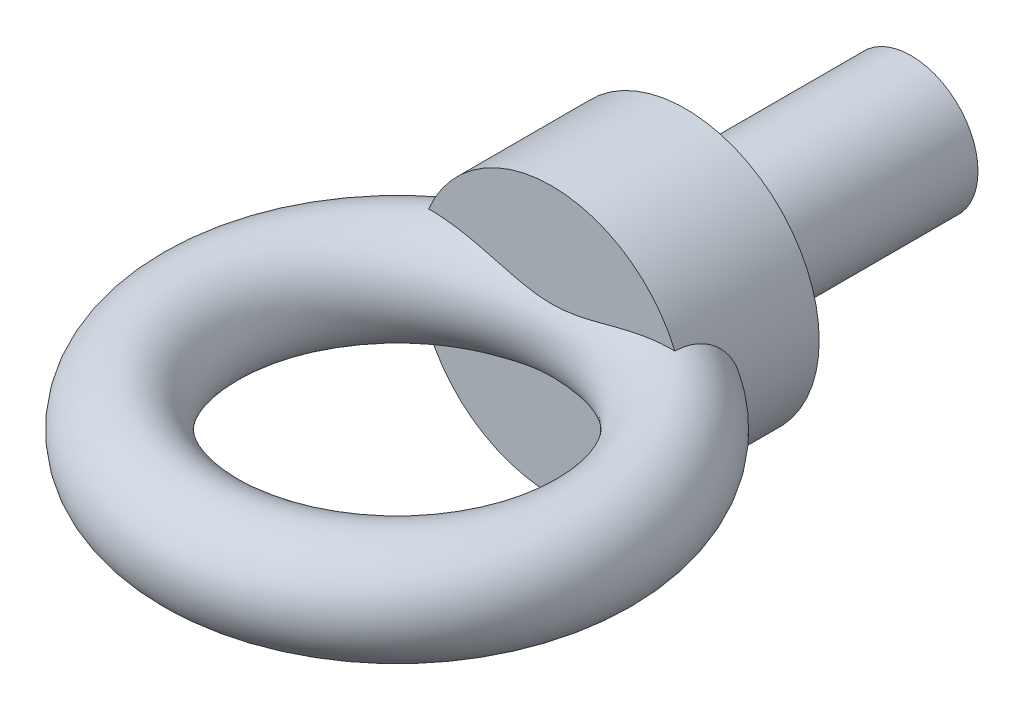
ISO-10303-21;
HEADER;
FILE_DESCRIPTION(('STEP AP214'),'2;1');
FILE_NAME('part.step','',(''),(''),'','','');
FILE_SCHEMA(('AUTOMOTIVE_DESIGN { 1 0 10303 214 1 1 1 1 }'));
ENDSEC;
DATA;
#1=APPLICATION_CONTEXT('core data for automotive mechanical design processes');
#2=APPLICATION_PROTOCOL_DEFINITION('international standard','automotive_design',2000,#1);
#3=PRODUCT_CONTEXT('',#1,'mechanical');
#4=PRODUCT('Part','Part','',(#3));
#5=PRODUCT_RELATED_PRODUCT_CATEGORY('part','',(#4));
#6=PRODUCT_DEFINITION_FORMATION('','',#4);
#7=PRODUCT_DEFINITION_CONTEXT('part definition',#1,'design');
#8=PRODUCT_DEFINITION('design','',#6,#7);
#9=PRODUCT_DEFINITION_SHAPE('','',#8);
#10=(LENGTH_UNIT() NAMED_UNIT(*) SI_UNIT(.MILLI.,.METRE.));
#11=(NAMED_UNIT(*) PLANE_ANGLE_UNIT() SI_UNIT($,.RADIAN.));
#12=(NAMED_UNIT(*) SI_UNIT($,.STERADIAN.) SOLID_ANGLE_UNIT());
#13=UNCERTAINTY_MEASURE_WITH_UNIT(LENGTH_MEASURE(1.E-05),#10,'distance_accuracy_value','');
#14=(GEOMETRIC_REPRESENTATION_CONTEXT(3) GLOBAL_UNCERTAINTY_ASSIGNED_CONTEXT((#13)) GLOBAL_UNIT_ASSIGNED_CONTEXT((#10,
#11,#12)) REPRESENTATION_CONTEXT('',''));
#15=CARTESIAN_POINT('',(0.,0.,0.));
#16=DIRECTION('',(0.,0.,1.));
#17=DIRECTION('',(1.,0.,0.));
#18=AXIS2_PLACEMENT_3D('',#15,#16,#17);
#19=CARTESIAN_POINT('',(0.,0.,38.));
#20=DIRECTION('',(0.,0.,-1.));
#21=DIRECTION('',(-1.,0.,0.));
#22=AXIS2_PLACEMENT_3D('',#19,#20,#21);
#23=CYLINDRICAL_SURFACE('',#22,8.);
#24=CARTESIAN_POINT('',(0.,0.,27.));
#25=DIRECTION('',(0.,0.,-1.));
#26=DIRECTION('',(-1.,0.,0.));
#27=AXIS2_PLACEMENT_3D('',#24,#25,#26);
#28=CIRCLE('',#27,8.);
#29=CARTESIAN_POINT('',(-8.,0.,27.));
#30=VERTEX_POINT('',#29);
#31=EDGE_CURVE('E40',#30,#30,#28,.T.);
#32=ORIENTED_EDGE('',*,*,#31,.T.);
#33=EDGE_LOOP('',(#32));
#34=FACE_BOUND('',#33,.T.);
#35=CARTESIAN_POINT('',(0.,0.,0.));
#36=DIRECTION('',(0.,0.,1.));
#37=DIRECTION('',(1.,0.,0.));
#38=AXIS2_PLACEMENT_3D('',#35,#36,#37);
#39=CIRCLE('',#38,8.);
#40=CARTESIAN_POINT('',(8.,0.,0.));
#41=VERTEX_POINT('',#40);
#42=EDGE_CURVE('E70',#41,#41,#39,.T.);
#43=ORIENTED_EDGE('',*,*,#42,.T.);
#44=EDGE_LOOP('',(#43));
#45=FACE_BOUND('',#44,.T.);
#46=ADVANCED_FACE('F37',(#34,#45),#23,.T.);
#47=CARTESIAN_POINT('',(0.,0.,0.));
#48=DIRECTION('',(0.,0.,1.));
#49=DIRECTION('',(1.,0.,0.));
#50=AXIS2_PLACEMENT_3D('',#47,#48,#49);
#51=PLANE('',#50);
#52=ORIENTED_EDGE('',*,*,#42,.F.);
#53=EDGE_LOOP('',(#52));
#54=FACE_BOUND('',#53,.T.);
#55=ADVANCED_FACE('F95',(#54),#51,.F.);
#56=CARTESIAN_POINT('',(0.,0.,27.));
#57=DIRECTION('',(0.,0.,-1.));
#58=DIRECTION('',(-1.,0.,0.));
#59=AXIS2_PLACEMENT_3D('',#56,#57,#58);
#60=PLANE('',#59);
#61=CARTESIAN_POINT('',(0.,0.,27.));
#62=DIRECTION('',(0.,0.,-1.));
#63=DIRECTION('',(-1.,0.,0.));
#64=AXIS2_PLACEMENT_3D('',#61,#62,#63);
#65=CIRCLE('',#64,16.);
#66=CARTESIAN_POINT('',(-16.,0.,27.));
#67=VERTEX_POINT('',#66);
#68=EDGE_CURVE('E104',#67,#67,#65,.T.);
#69=ORIENTED_EDGE('',*,*,#68,.T.);
#70=EDGE_LOOP('',(#69));
#71=FACE_BOUND('',#70,.T.);
#72=ORIENTED_EDGE('',*,*,#31,.F.);
#73=EDGE_LOOP('',(#72));
#74=FACE_BOUND('',#73,.T.);
#75=ADVANCED_FACE('F91',(#71,#74),#60,.T.);
#76=CARTESIAN_POINT('',(0.,0.,43.));
#77=DIRECTION('',(0.,0.,-1.));
#78=DIRECTION('',(-1.,0.,0.));
#79=AXIS2_PLACEMENT_3D('',#76,#77,#78);
#80=PLANE('',#79);
#81=CARTESIAN_POINT('',(0.,3.75,43.));
#82=CARTESIAN_POINT('',(-0.198423396746859,3.74999995550212,43.));
#83=CARTESIAN_POINT('',(-0.396846671015667,3.75427233843891,43.));
#84=CARTESIAN_POINT('',(-0.793333269074827,3.77118099676362,43.));
#85=CARTESIAN_POINT('',(-0.991396589913736,3.78381734042451,43.));
#86=CARTESIAN_POINT('',(-1.3869247684004,3.81694718796056,43.));
#87=CARTESIAN_POINT('',(-1.58438940026312,3.83744335550718,43.));
#88=CARTESIAN_POINT('',(-1.97846242137758,3.88552072140098,43.));
#89=CARTESIAN_POINT('',(-2.17507072089126,3.91310264494743,43.));
#90=CARTESIAN_POINT('',(-2.7658891808467,4.00546937939409,43.));
#91=CARTESIAN_POINT('',(-3.15862776940045,4.07964733416842,43.));
#92=CARTESIAN_POINT('',(-3.94043001600997,4.24467462046787,43.));
#93=CARTESIAN_POINT('',(-4.32949361657075,4.33552421236711,43.));
#94=CARTESIAN_POINT('',(-5.11418581352902,4.52844031136013,43.));
#95=CARTESIAN_POINT('',(-5.50976213914991,4.63071514791662,43.));
#96=CARTESIAN_POINT('',(-6.30019287796965,4.83789823443915,43.));
#97=CARTESIAN_POINT('',(-6.69504731358739,4.94280640108159,43.));
#98=CARTESIAN_POINT('',(-7.48440322741912,5.14927849238733,43.));
#99=CARTESIAN_POINT('',(-7.87890231799305,5.25085135944986,43.));
#100=CARTESIAN_POINT('',(-8.66983609693245,5.44611975373133,43.));
#101=CARTESIAN_POINT('',(-9.06627060816277,5.53981598805375,43.));
#102=CARTESIAN_POINT('',(-9.90912522672644,5.72534373448948,43.));
#103=CARTESIAN_POINT('',(-10.3558920053108,5.81563321804062,43.));
#104=CARTESIAN_POINT('',(-11.2536667751676,5.97506002743001,43.));
#105=CARTESIAN_POINT('',(-11.7046780237068,6.04417946138532,43.));
#106=CARTESIAN_POINT('',(-12.6070125776594,6.1548724126057,43.));
#107=CARTESIAN_POINT('',(-13.0583122290433,6.19663282058239,43.));
#108=CARTESIAN_POINT('',(-13.9626499104719,6.24731404678441,43.));
#109=CARTESIAN_POINT('',(-14.415686672986,6.25625544112103,43.));
#110=CARTESIAN_POINT('',(-15.1756247315836,6.23833154015333,43.));
#111=CARTESIAN_POINT('',(-15.4827582390791,6.22203801264576,43.));
#112=CARTESIAN_POINT('',(-16.095223713451,6.16926798742631,43.));
#113=CARTESIAN_POINT('',(-16.4005554913617,6.13278940943293,43.));
#114=CARTESIAN_POINT('',(-17.3117031147484,5.98959223925518,43.));
#115=CARTESIAN_POINT('',(-17.9132046904611,5.84910763830606,43.));
#116=CARTESIAN_POINT('',(-18.7080986991128,5.58461304841486,43.));
#117=CARTESIAN_POINT('',(-18.9175015433598,5.50706057973655,43.));
#118=CARTESIAN_POINT('',(-19.3302013865198,5.33697203707702,43.));
#119=CARTESIAN_POINT('',(-19.5334988779317,5.2444371755459,43.));
#120=CARTESIAN_POINT('',(-19.9319902865479,5.04380926426041,43.));
#121=CARTESIAN_POINT('',(-20.1271933815675,4.93573449241167,43.));
#122=CARTESIAN_POINT('',(-20.5077293554823,4.70340025648093,43.));
#123=CARTESIAN_POINT('',(-20.6930646216145,4.57914473216071,43.));
#124=CARTESIAN_POINT('',(-21.0135686322292,4.34222435078197,43.));
#125=CARTESIAN_POINT('',(-21.1510480079273,4.23267952394133,43.));
#126=CARTESIAN_POINT('',(-21.417165774657,4.00334748863613,43.));
#127=CARTESIAN_POINT('',(-21.5458061566497,3.88356260045183,43.));
#128=CARTESIAN_POINT('',(-21.792943907475,3.6338441612182,43.));
#129=CARTESIAN_POINT('',(-21.9114379225744,3.50390728150931,43.));
#130=CARTESIAN_POINT('',(-22.1367350141629,3.23433693483305,43.));
#131=CARTESIAN_POINT('',(-22.2435434393351,3.09470795233645,43.));
#132=CARTESIAN_POINT('',(-22.4450326247993,2.80487355984491,43.));
#133=CARTESIAN_POINT('',(-22.5395831440075,2.65457728799674,43.));
#134=CARTESIAN_POINT('',(-22.7137366549663,2.3456411220357,43.));
#135=CARTESIAN_POINT('',(-22.7933477995545,2.18700583962294,43.));
#136=CARTESIAN_POINT('',(-22.9362209961176,1.86262371130598,43.));
#137=CARTESIAN_POINT('',(-22.9994923801865,1.69688098801714,43.));
#138=CARTESIAN_POINT('',(-23.1084960040307,1.35973009663464,43.));
#139=CARTESIAN_POINT('',(-23.1542317940507,1.18832308297057,43.));
#140=CARTESIAN_POINT('',(-23.2216665713312,0.868015134277959,43.));
#141=CARTESIAN_POINT('',(-23.2459635307068,0.719656556359104,43.));
#142=CARTESIAN_POINT('',(-23.2808955091594,0.421344428898531,43.));
#143=CARTESIAN_POINT('',(-23.2915320794188,0.271391062400446,43.));
#144=CARTESIAN_POINT('',(-23.2989712394451,-0.0287938549404037,43.));
#145=CARTESIAN_POINT('',(-23.2957795798328,-0.179025264180264,43.));
#146=CARTESIAN_POINT('',(-23.2756271470357,-0.478559371286684,43.));
#147=CARTESIAN_POINT('',(-23.2586667497531,-0.627862094395302,43.));
#148=CARTESIAN_POINT('',(-23.2131375035494,-0.912514021152957,43.));
#149=CARTESIAN_POINT('',(-23.1855980339577,-1.04802936837302,43.));
#150=CARTESIAN_POINT('',(-23.1194384312782,-1.31637009914684,43.));
#151=CARTESIAN_POINT('',(-23.0808148243673,-1.44919462539055,43.));
#152=CARTESIAN_POINT('',(-22.9929940111684,-1.71123600525403,43.));
#153=CARTESIAN_POINT('',(-22.9438008927572,-1.84045423188068,43.));
#154=CARTESIAN_POINT('',(-22.8354006679346,-2.09466413876428,43.));
#155=CARTESIAN_POINT('',(-22.7761898607177,-2.21965423648478,43.));
#156=CARTESIAN_POINT('',(-22.6456765773356,-2.47001409173636,43.));
#157=CARTESIAN_POINT('',(-22.5739646186059,-2.59517051328209,43.));
#158=CARTESIAN_POINT('',(-22.4211674763651,-2.83964403226768,43.));
#159=CARTESIAN_POINT('',(-22.3400785661125,-2.95895878101335,43.));
#160=CARTESIAN_POINT('',(-22.0839433996449,-3.30746007841177,43.));
#161=CARTESIAN_POINT('',(-21.8959642683196,-3.52732532977695,43.));
#162=CARTESIAN_POINT('',(-21.5533226117657,-3.87742438428632,43.));
#163=CARTESIAN_POINT('',(-21.4056759409805,-4.01471025223961,43.));
#164=CARTESIAN_POINT('',(-21.0988520364842,-4.27586003170931,43.));
#165=CARTESIAN_POINT('',(-20.9396712985938,-4.39971983546844,43.));
#166=CARTESIAN_POINT('',(-20.6114661762948,-4.63416116072778,43.));
#167=CARTESIAN_POINT('',(-20.4424258470511,-4.74472023574139,43.));
#168=CARTESIAN_POINT('',(-20.0963853050063,-4.95262462218103,43.));
#169=CARTESIAN_POINT('',(-19.9193829787294,-5.04996639724962,43.));
#170=CARTESIAN_POINT('',(-19.4925633434036,-5.26529943747948,43.));
#171=CARTESIAN_POINT('',(-19.2399207154444,-5.3777070968034,43.));
#172=CARTESIAN_POINT('',(-18.7257235289241,-5.57987763461362,43.));
#173=CARTESIAN_POINT('',(-18.4641654084163,-5.66963133905002,43.));
#174=CARTESIAN_POINT('',(-17.9348912860215,-5.82797617908452,43.));
#175=CARTESIAN_POINT('',(-17.6671780248965,-5.89657654498519,43.));
#176=CARTESIAN_POINT('',(-17.1276096357227,-6.01427738082363,43.));
#177=CARTESIAN_POINT('',(-16.8557551429958,-6.06338081119012,43.));
#178=CARTESIAN_POINT('',(-16.1519663564316,-6.16690757222461,43.));
#179=CARTESIAN_POINT('',(-15.7180645077628,-6.2080892297402,43.));
#180=CARTESIAN_POINT('',(-14.8480893402886,-6.25231851171307,43.));
#181=CARTESIAN_POINT('',(-14.4120141106986,-6.25532263547538,43.));
#182=CARTESIAN_POINT('',(-13.5376398424001,-6.22886156791381,43.));
#183=CARTESIAN_POINT('',(-13.0993491548057,-6.19914896185863,43.));
#184=CARTESIAN_POINT('',(-12.2263273708261,-6.11255245873142,43.));
#185=CARTESIAN_POINT('',(-11.7915915416811,-6.05571415854742,43.));
#186=CARTESIAN_POINT('',(-10.777715465773,-5.89702958545962,43.));
#187=CARTESIAN_POINT('',(-10.1999657838886,-5.78644150555436,43.));
#188=CARTESIAN_POINT('',(-9.3377898745057,-5.6005087548055,43.));
#189=CARTESIAN_POINT('',(-9.05108794268787,-5.53517578276686,43.));
#190=CARTESIAN_POINT('',(-8.47888051733222,-5.39944988519891,43.));
#191=CARTESIAN_POINT('',(-8.19337501014559,-5.32905701756013,43.));
#192=CARTESIAN_POINT('',(-7.62197550842847,-5.18461531821318,43.));
#193=CARTESIAN_POINT('',(-7.33608526398849,-5.11055186070995,43.));
#194=CARTESIAN_POINT('',(-6.7646923620775,-4.9609443426892,43.));
#195=CARTESIAN_POINT('',(-6.47918970785066,-4.88540026985947,43.));
#196=CARTESIAN_POINT('',(-5.90781334748087,-4.73488792483878,43.));
#197=CARTESIAN_POINT('',(-5.62193952195269,-4.65992010223917,43.));
#198=CARTESIAN_POINT('',(-5.04940103557008,-4.5130194016709,43.));
#199=CARTESIAN_POINT('',(-4.7627363686684,-4.44108654697835,43.));
#200=CARTESIAN_POINT('',(-4.19066425418257,-4.30365421838109,43.));
#201=CARTESIAN_POINT('',(-3.90526985679876,-4.23810119970996,43.));
#202=CARTESIAN_POINT('',(-3.33258453320332,-4.11570506173031,43.));
#203=CARTESIAN_POINT('',(-3.04529359499694,-4.05886199756342,43.));
#204=CARTESIAN_POINT('',(-2.46908343251301,-3.9572281519219,43.));
#205=CARTESIAN_POINT('',(-2.18016813722613,-3.91241556209669,43.));
#206=CARTESIAN_POINT('',(-1.60038042434401,-3.83783450120299,43.));
#207=CARTESIAN_POINT('',(-1.30950819317648,-3.80806461709069,43.));
#208=CARTESIAN_POINT('',(-0.728682668033709,-3.76616545586183,43.));
#209=CARTESIAN_POINT('',(-0.438739182381732,-3.7539038715317,43.));
#210=CARTESIAN_POINT('',(0.141344715081138,-3.74768969643752,43.));
#211=CARTESIAN_POINT('',(0.431485123261104,-3.75373677679419,43.));
#212=CARTESIAN_POINT('',(1.01115999125035,-3.78360946531476,43.));
#213=CARTESIAN_POINT('',(1.30069335856246,-3.80745567710119,43.));
#214=CARTESIAN_POINT('',(1.87800743748997,-3.87093784803906,43.));
#215=CARTESIAN_POINT('',(2.16578796955785,-3.91057539801428,43.));
#216=CARTESIAN_POINT('',(2.73982142262915,-4.0028298912073,43.));
#217=CARTESIAN_POINT('',(3.02606998341025,-4.05547336652715,43.));
#218=CARTESIAN_POINT('',(3.59656698102858,-4.17049652512421,43.));
#219=CARTESIAN_POINT('',(3.88081541862102,-4.23287620472497,43.));
#220=CARTESIAN_POINT('',(4.44779792748375,-4.36431384910602,43.));
#221=CARTESIAN_POINT('',(4.7305316960506,-4.43337309982754,43.));
#222=CARTESIAN_POINT('',(5.29500618268296,-4.57539935942628,43.));
#223=CARTESIAN_POINT('',(5.57674689147766,-4.64836640468272,43.));
#224=CARTESIAN_POINT('',(6.14317227202853,-4.79666060750985,43.));
#225=CARTESIAN_POINT('',(6.42785225591383,-4.87200548807052,43.));
#226=CARTESIAN_POINT('',(6.99736751701189,-5.02201447785041,43.));
#227=CARTESIAN_POINT('',(7.28220277948276,-5.09667864269591,43.));
#228=CARTESIAN_POINT('',(7.85246596680532,-5.24335739472754,43.));
#229=CARTESIAN_POINT('',(8.13789367237814,-5.31537282367618,43.));
#230=CARTESIAN_POINT('',(8.70982009250352,-5.45500397723036,43.));
#231=CARTESIAN_POINT('',(8.99631879687006,-5.52261974356809,43.));
#232=CARTESIAN_POINT('',(9.85597295310252,-5.7159313995529,43.));
#233=CARTESIAN_POINT('',(10.4312254170602,-5.83261452574154,43.));
#234=CARTESIAN_POINT('',(11.5879748236467,-6.02927905682577,43.));
#235=CARTESIAN_POINT('',(12.169467941493,-6.10928175956268,43.));
#236=CARTESIAN_POINT('',(13.0432003500798,-6.19210514035793,43.));
#237=CARTESIAN_POINT('',(13.3336760950507,-6.21350544835059,43.));
#238=CARTESIAN_POINT('',(13.9153030314038,-6.24251959204934,43.));
#239=CARTESIAN_POINT('',(14.2064542774692,-6.25013226964452,43.));
#240=CARTESIAN_POINT('',(15.0791338519432,-6.24973087523678,43.));
#241=CARTESIAN_POINT('',(15.6611010166147,-6.21860597498551,43.));
#242=CARTESIAN_POINT('',(16.5192339901242,-6.1158115438755,43.));
#243=CARTESIAN_POINT('',(16.7990304340724,-6.07315483610391,43.));
#244=CARTESIAN_POINT('',(17.3551032634806,-5.96804057022212,43.));
#245=CARTESIAN_POINT('',(17.631377836164,-5.90557321182636,43.));
#246=CARTESIAN_POINT('',(18.179323034365,-5.75877796661344,43.));
#247=CARTESIAN_POINT('',(18.4509707757578,-5.67436348691614,43.));
#248=CARTESIAN_POINT('',(18.9857130095649,-5.48216753862108,43.));
#249=CARTESIAN_POINT('',(19.2488113140967,-5.37439665351615,43.));
#250=CARTESIAN_POINT('',(19.8695404461021,-5.08417402601651,43.));
#251=CARTESIAN_POINT('',(20.2215758597036,-4.88923383995729,43.));
#252=CARTESIAN_POINT('',(20.7227631868834,-4.55755470348433,43.));
#253=CARTESIAN_POINT('',(20.8852126693848,-4.44057414223244,43.));
#254=CARTESIAN_POINT('',(21.1996767491117,-4.19328885369036,43.));
#255=CARTESIAN_POINT('',(21.3516940352491,-4.06298758155205,43.));
#256=CARTESIAN_POINT('',(21.6172959146,-3.8136133203118,43.));
#257=CARTESIAN_POINT('',(21.7328986195681,-3.6966844550917,43.));
#258=CARTESIAN_POINT('',(21.9545732127698,-3.45412814972378,43.));
#259=CARTESIAN_POINT('',(22.0606471137674,-3.32850255655486,43.));
#260=CARTESIAN_POINT('',(22.2621415682476,-3.0688309318631,43.));
#261=CARTESIAN_POINT('',(22.3575552687011,-2.93477956927015,43.));
#262=CARTESIAN_POINT('',(22.5363896744976,-2.65896592166994,43.));
#263=CARTESIAN_POINT('',(22.6198157206666,-2.5172071095863,43.));
#264=CARTESIAN_POINT('',(22.7741345256525,-2.22558110918198,43.));
#265=CARTESIAN_POINT('',(22.844924149091,-2.07565917230263,43.));
#266=CARTESIAN_POINT('',(22.9719980039413,-1.76985849165559,43.));
#267=CARTESIAN_POINT('',(23.0282894373947,-1.61398274982994,43.));
#268=CARTESIAN_POINT('',(23.1254157571944,-1.29755195188226,43.));
#269=CARTESIAN_POINT('',(23.166257539145,-1.13699901786325,43.));
#270=CARTESIAN_POINT('',(23.231760846586,-0.812631060634574,43.));
#271=CARTESIAN_POINT('',(23.256424672459,-0.648816504617394,43.));
#272=CARTESIAN_POINT('',(23.2870274102391,-0.340520302060521,43.));
#273=CARTESIAN_POINT('',(23.2949504464328,-0.196232467211082,43.));
#274=CARTESIAN_POINT('',(23.2980092472342,0.0924756891008986,43.));
#275=CARTESIAN_POINT('',(23.2931458501982,0.236896001256779,43.));
#276=CARTESIAN_POINT('',(23.2707073736324,0.524706330197441,43.));
#277=CARTESIAN_POINT('',(23.2531353547421,0.668096586656662,43.));
#278=CARTESIAN_POINT('',(23.2055426253827,0.952793567715443,43.));
#279=CARTESIAN_POINT('',(23.1755218695112,1.09410028471407,43.));
#280=CARTESIAN_POINT('',(23.1049673084847,1.36777077982335,43.));
#281=CARTESIAN_POINT('',(23.0649244812013,1.50026167836337,43.));
#282=CARTESIAN_POINT('',(22.9742930191328,1.76162598732406,43.));
#283=CARTESIAN_POINT('',(22.9237009853988,1.89049821658903,43.));
#284=CARTESIAN_POINT('',(22.8125890810736,2.14383896580503,43.));
#285=CARTESIAN_POINT('',(22.7520723039278,2.26830884327693,43.));
#286=CARTESIAN_POINT('',(22.6217664083335,2.51231600559827,43.));
#287=CARTESIAN_POINT('',(22.5519738754772,2.6318514527448,43.));
#288=CARTESIAN_POINT('',(22.3190024833443,2.99917690534585,43.));
#289=CARTESIAN_POINT('',(22.1403029505801,3.23730831600603,43.));
#290=CARTESIAN_POINT('',(21.7506390791843,3.68532490801034,43.));
#291=CARTESIAN_POINT('',(21.5396557661491,3.89519334085332,43.));
#292=CARTESIAN_POINT('',(21.1538237805208,4.23187356328378,43.));
#293=CARTESIAN_POINT('',(20.9849744522076,4.36566241774674,43.));
#294=CARTESIAN_POINT('',(20.6361523870158,4.61791752302886,43.));
#295=CARTESIAN_POINT('',(20.4561758301895,4.73637846816793,43.));
#296=CARTESIAN_POINT('',(19.902229561466,5.0694351872953,43.));
#297=CARTESIAN_POINT('',(19.514571360657,5.2614266366353,43.));
#298=CARTESIAN_POINT('',(18.5552545354118,5.65572605729238,43.));
#299=CARTESIAN_POINT('',(17.9725412377852,5.83085520838686,43.));
#300=CARTESIAN_POINT('',(17.0846480872716,6.02318412183355,43.));
#301=CARTESIAN_POINT('',(16.786207327266,6.07557596773712,43.));
#302=CARTESIAN_POINT('',(16.1863393200067,6.15913450186268,43.));
#303=CARTESIAN_POINT('',(15.8849123756549,6.1903033209119,43.));
#304=CARTESIAN_POINT('',(15.0769289037944,6.2480594463329,43.));
#305=CARTESIAN_POINT('',(14.5691390837394,6.25737803128975,43.));
#306=CARTESIAN_POINT('',(13.554536828501,6.23165520108445,43.));
#307=CARTESIAN_POINT('',(13.0477258482302,6.19657009309426,43.));
#308=CARTESIAN_POINT('',(12.0336925535253,6.09019336512061,43.));
#309=CARTESIAN_POINT('',(11.5265039750508,6.01859386693228,43.));
#310=CARTESIAN_POINT('',(10.5175287027518,5.84751564272656,43.));
#311=CARTESIAN_POINT('',(10.0157371433259,5.74806468185829,43.));
#312=CARTESIAN_POINT('',(9.11579353120014,5.55124847255307,43.));
#313=CARTESIAN_POINT('',(8.71685295561798,5.45739257505687,43.));
#314=CARTESIAN_POINT('',(7.92096633704098,5.26153538333205,43.));
#315=CARTESIAN_POINT('',(7.52402046432249,5.15953340586513,43.));
#316=CARTESIAN_POINT('',(6.72979634541329,4.95199387356586,43.));
#317=CARTESIAN_POINT('',(6.33252069474091,4.84644660137152,43.));
#318=CARTESIAN_POINT('',(5.53727953709038,4.63785832222211,43.));
#319=CARTESIAN_POINT('',(5.13931400721893,4.53481740021321,43.));
#320=CARTESIAN_POINT('',(4.35036736710686,4.34047222489773,43.));
#321=CARTESIAN_POINT('',(3.95944118460166,4.2489494859741,43.));
#322=CARTESIAN_POINT('',(3.17389148317248,4.08261964910723,43.));
#323=CARTESIAN_POINT('',(2.77926801978331,4.00781230050934,43.));
#324=CARTESIAN_POINT('',(2.18560499761417,3.91462991212061,43.));
#325=CARTESIAN_POINT('',(1.98805322840746,3.88679852281443,43.));
#326=CARTESIAN_POINT('',(1.59208268089847,3.83827893843412,43.));
#327=CARTESIAN_POINT('',(1.39366399447197,3.81759000414785,43.));
#328=CARTESIAN_POINT('',(0.996220052061525,3.78414532050323,43.));
#329=CARTESIAN_POINT('',(0.797195028952794,3.77138683674449,43.));
#330=CARTESIAN_POINT('',(0.398779960271054,3.75431424027366,43.));
#331=CARTESIAN_POINT('',(0.199389918298457,3.75000004471462,43.));
#332=CARTESIAN_POINT('',(0.,3.75,43.));
#333=B_SPLINE_CURVE_WITH_KNOTS('',3,(#81,#82,#83,#84,#85,#86,#87,#88,#89,#90,#91,#92,#93,#94,
#95,#96,#97,#98,#99,#100,#101,#102,#103,#104,#105,#106,#107,#108,#109,#110,#111,#112,#113,#114,
#115,#116,#117,#118,#119,#120,#121,#122,#123,#124,#125,#126,#127,#128,#129,#130,#131,#132,#133,
#134,#135,#136,#137,#138,#139,#140,#141,#142,#143,#144,#145,#146,#147,#148,#149,#150,#151,#152,
#153,#154,#155,#156,#157,#158,#159,#160,#161,#162,#163,#164,#165,#166,#167,#168,#169,#170,#171,
#172,#173,#174,#175,#176,#177,#178,#179,#180,#181,#182,#183,#184,#185,#186,#187,#188,#189,#190,
#191,#192,#193,#194,#195,#196,#197,#198,#199,#200,#201,#202,#203,#204,#205,#206,#207,#208,#209,
#210,#211,#212,#213,#214,#215,#216,#217,#218,#219,#220,#221,#222,#223,#224,#225,#226,#227,#228,
#229,#230,#231,#232,#233,#234,#235,#236,#237,#238,#239,#240,#241,#242,#243,#244,#245,#246,#247,
#248,#249,#250,#251,#252,#253,#254,#255,#256,#257,#258,#259,#260,#261,#262,#263,#264,#265,#266,
#267,#268,#269,#270,#271,#272,#273,#274,#275,#276,#277,#278,#279,#280,#281,#282,#283,#284,#285,
#286,#287,#288,#289,#290,#291,#292,#293,#294,#295,#296,#297,#298,#299,#300,#301,#302,#303,#304,
#305,#306,#307,#308,#309,#310,#311,#312,#313,#314,#315,#316,#317,#318,#319,#320,#321,#322,#323,
#324,#325,#326,#327,#328,#329,#330,#331,#332),.UNSPECIFIED.,.T.,.F.,(4,2,2,2,2,2,2,2,2,2,2,2,2,
2,2,2,2,2,2,2,2,2,2,2,2,2,2,2,2,2,2,2,2,2,2,2,2,2,2,2,2,2,2,2,2,2,2,2,2,2,2,2,2,2,2,2,2,2,2,2,2,
2,2,2,2,2,2,2,2,2,2,2,2,2,2,2,2,2,2,2,2,2,2,2,2,2,2,2,2,2,2,2,2,2,2,2,2,2,2,2,2,2,2,2,2,2,2,2,2,
2,2,2,2,2,2,2,2,2,2,2,2,2,2,2,2,4),(0.,0.595225231865657,1.19045532246982,1.78588731334739,
2.38138026864347,3.5797778540591,4.77819415738989,6.00390235359534,7.22957181481862,
8.45163011591722,9.67357859261079,11.0405994752606,12.4087725287151,13.7674992885905,
15.1253740395237,16.0474093546301,16.9695397128657,18.8122118738487,19.4816967585881,
20.1511274923195,20.8197771923015,21.488264389822,22.0151509318118,22.5419184022095,
23.0688593211368,23.5955580326582,24.1274602949314,24.6590714335733,25.1903782793925,
25.7215775003074,26.1719789620527,26.6223292747029,27.0724923222241,27.5226430801946,
27.9370284575751,28.3515438474613,28.7658992065472,29.1804079753136,29.6126827481439,
30.0451299170074,30.9096153160083,31.5137493139397,32.1180676304243,32.7233919064641,
33.3288778223698,34.157184997063,34.9858270705926,35.8141070511111,36.6422612168627,
37.9476679889165,39.2545620497363,40.5714075739792,41.8860473040736,43.6496778970184,
44.531812009634,45.413936031314,46.2999130545059,47.1858974482562,48.0725143799586,
48.9591381101642,49.8375274091328,50.7159222688446,51.5927138905175,52.4694231350283,
53.3394715260005,54.2095042883518,55.0805457336749,55.9516749501522,56.8245961614332,
57.6975170430944,58.5706063139722,59.4437037141995,60.3271499133378,61.210523260599,
62.0936134044067,62.9766951706071,64.736837800691,66.4959571366787,67.3694357708164,
68.2429877705876,69.9864468439798,70.8349746126211,71.6839228026066,72.5362727566744,
73.3882372897649,74.5903973991135,75.1903890423848,75.7902254516304,76.2830475019708,
76.7757652077872,77.2687978619576,77.7616101710389,78.258277104581,78.7546968386294,
79.2508947447452,79.747022079986,80.1799873350726,80.6129242030308,81.0457568407566,
81.4785910571036,81.8933634209827,82.3082696313773,82.7230467644906,83.1379770022317,
84.027420157528,84.917388094647,85.562829303575,86.2084933344944,87.5010951742215,
89.3160029309095,90.2244838326932,91.1328735080267,92.6539375185634,94.1764994065292,
95.7121167150839,97.2462085815915,98.4755874687902,99.7050695765157,100.938252182246,
102.171476525399,103.37579547431,104.580096362713,105.17849517844,105.776832043985,
106.374962489804,106.973087067332),.UNSPECIFIED.);
#334=CARTESIAN_POINT('',(-14.7295451407545,-6.24823974783893,43.));
#335=VERTEX_POINT('',#334);
#336=CARTESIAN_POINT('',(14.7295451407506,-6.24823974784829,43.));
#337=VERTEX_POINT('',#336);
#338=EDGE_CURVE('E11',#335,#337,#333,.T.);
#339=ORIENTED_EDGE('',*,*,#338,.F.);
#340=CARTESIAN_POINT('',(0.,0.,43.));
#341=DIRECTION('',(0.,0.,-1.));
#342=DIRECTION('',(-1.,0.,0.));
#343=AXIS2_PLACEMENT_3D('',#340,#341,#342);
#344=CIRCLE('',#343,16.);
#345=EDGE_CURVE('E74',#337,#335,#344,.T.);
#346=ORIENTED_EDGE('',*,*,#345,.F.);
#347=EDGE_LOOP('',(#339,#346));
#348=FACE_BOUND('',#347,.T.);
#349=ADVANCED_FACE('F90',(#348),#80,.F.);
#350=CARTESIAN_POINT('',(0.,0.,43.));
#351=DIRECTION('',(0.,0.,-1.));
#352=DIRECTION('',(-1.,0.,0.));
#353=AXIS2_PLACEMENT_3D('',#350,#351,#352);
#354=CYLINDRICAL_SURFACE('',#353,16.);
#355=CARTESIAN_POINT('',(-14.7295451407331,6.24823974783925,43.));
#356=VERTEX_POINT('',#355);
#357=CARTESIAN_POINT('',(14.7295451407545,6.24823974783894,43.));
#358=VERTEX_POINT('',#357);
#359=EDGE_CURVE('E53',#356,#358,#344,.T.);
#360=ORIENTED_EDGE('',*,*,#359,.T.);
#361=CARTESIAN_POINT('',(14.7295435562002,6.24824348325211,43.0002));
#362=CARTESIAN_POINT('',(14.7311426935097,6.24440595738366,42.7942033069384));
#363=CARTESIAN_POINT('',(14.7355083864795,6.23417254546949,42.5882356439155));
#364=CARTESIAN_POINT('',(14.7500837185215,6.19964661743251,42.1773736075713));
#365=CARTESIAN_POINT('',(14.7603027302665,6.17533155225782,41.9724814887627));
#366=CARTESIAN_POINT('',(14.7869520875158,6.11123559413107,41.5645413506973));
#367=CARTESIAN_POINT('',(14.8034101417141,6.07138568546909,41.3615057576419));
#368=CARTESIAN_POINT('',(14.8425117800897,5.97516209557051,40.9600889418201));
#369=CARTESIAN_POINT('',(14.8651513745001,5.91879907072804,40.7617048062278));
#370=CARTESIAN_POINT('',(14.9122078016202,5.79909375890518,40.4024816676962));
#371=CARTESIAN_POINT('',(14.9357707181541,5.73828326876328,40.2406854480574));
#372=CARTESIAN_POINT('',(14.9866103757785,5.60416398424615,39.9229718192274));
#373=CARTESIAN_POINT('',(15.013886511631,5.53085722621647,39.7670534572495));
#374=CARTESIAN_POINT('',(15.0714843415361,5.37191584797581,39.4627243346152));
#375=CARTESIAN_POINT('',(15.1017981877818,5.28631275865058,39.3142956453996));
#376=CARTESIAN_POINT('',(15.1647690256838,5.10285992823168,39.0257291935668));
#377=CARTESIAN_POINT('',(15.1974259884222,5.00501033826803,38.8855913286665));
#378=CARTESIAN_POINT('',(15.2642954890393,4.79721005770923,38.6143100044209));
#379=CARTESIAN_POINT('',(15.298512302613,4.68722476598812,38.4831940889219));
#380=CARTESIAN_POINT('',(15.367438915071,4.45604794765917,38.2313788890879));
#381=CARTESIAN_POINT('',(15.40214872437,4.33485618401364,38.110679825193));
#382=CARTESIAN_POINT('',(15.4710924093865,4.08197112231131,37.8803994439844));
#383=CARTESIAN_POINT('',(15.5053257537381,3.95026705519504,37.7708297958779));
#384=CARTESIAN_POINT('',(15.5722889610483,3.6774366385938,37.5636176352904));
#385=CARTESIAN_POINT('',(15.6050188560932,3.53631049035046,37.4659748681948));
#386=CARTESIAN_POINT('',(15.6669000097975,3.25096579622014,37.2864502035175));
#387=CARTESIAN_POINT('',(15.6961379192934,3.1070440748308,37.2041257550945));
#388=CARTESIAN_POINT('',(15.7515997561326,2.81239805249256,37.0513736563809));
#389=CARTESIAN_POINT('',(15.7778226123144,2.66167136025599,36.9809502300325));
#390=CARTESIAN_POINT('',(15.8265573468632,2.35461884350276,36.8523533647178));
#391=CARTESIAN_POINT('',(15.8490715861576,2.19829665888039,36.7941721257068));
#392=CARTESIAN_POINT('',(15.8898548440442,1.88098625133012,36.6901870310701));
#393=CARTESIAN_POINT('',(15.9081222805898,1.71999631457947,36.6443877870332));
#394=CARTESIAN_POINT('',(15.9402084822182,1.39188968136583,36.5647056343541));
#395=CARTESIAN_POINT('',(15.9539509914547,1.22471609359776,36.5310261768511));
#396=CARTESIAN_POINT('',(15.9762387349631,0.887861488091789,36.4767207784085));
#397=CARTESIAN_POINT('',(15.9847821519735,0.718179614824471,36.4560994016149));
#398=CARTESIAN_POINT('',(15.9964525259855,0.37755232027551,36.4279891409123));
#399=CARTESIAN_POINT('',(15.9995796634251,0.206606941276827,36.420499819522));
#400=CARTESIAN_POINT('',(16.0003410364738,-0.135366501993656,36.4186735577385));
#401=CARTESIAN_POINT('',(15.9979752459826,-0.306394566654488,36.4243366798408));
#402=CARTESIAN_POINT('',(15.9877505169313,-0.649299525768029,36.4489397005019));
#403=CARTESIAN_POINT('',(15.9798290192358,-0.821163732479731,36.4680308098355));
#404=CARTESIAN_POINT('',(15.9586299497249,-1.16247905057709,36.5195866473784));
#405=CARTESIAN_POINT('',(15.9453542266159,-1.33193097398939,36.5520467596217));
#406=CARTESIAN_POINT('',(15.9137799099982,-1.66733094691981,36.630253673786));
#407=CARTESIAN_POINT('',(15.8954794672656,-1.83327768217853,36.6760053677059));
#408=CARTESIAN_POINT('',(15.8543398722307,-2.16033871309883,36.7806175780396));
#409=CARTESIAN_POINT('',(15.8315024667887,-2.32145484128812,36.8394730501735));
#410=CARTESIAN_POINT('',(15.7819441013829,-2.63737528388999,36.969934852708));
#411=CARTESIAN_POINT('',(15.7552322812348,-2.79219338434995,37.0415112613216));
#412=CARTESIAN_POINT('',(15.6986119453587,-3.09471440937468,37.1971842719201));
#413=CARTESIAN_POINT('',(15.6687046837992,-3.24242009268861,37.2812759668761));
#414=CARTESIAN_POINT('',(15.6064987007609,-3.52970315634619,37.4616224300938));
#415=CARTESIAN_POINT('',(15.574199720198,-3.66927965315684,37.5578785168706));
#416=CARTESIAN_POINT('',(15.5081132415648,-3.9392564049478,37.7620425938579));
#417=CARTESIAN_POINT('',(15.4743257707989,-4.06965682813575,37.869950370388));
#418=CARTESIAN_POINT('',(15.4067777090221,-4.31827809379559,38.0949092389542));
#419=CARTESIAN_POINT('',(15.3730258591596,-4.43666429661593,38.2117802516008));
#420=CARTESIAN_POINT('',(15.3059288128681,-4.66288185870747,38.4554304196236));
#421=CARTESIAN_POINT('',(15.2725836097481,-4.77071339185176,38.5822094117183));
#422=CARTESIAN_POINT('',(15.2072202903335,-4.97513465793252,38.8447080615811));
#423=CARTESIAN_POINT('',(15.1752013381814,-5.07173154301092,38.9804219441176));
#424=CARTESIAN_POINT('',(15.1132984490014,-5.25332442028276,39.2598530628549));
#425=CARTESIAN_POINT('',(15.0834144920381,-5.33832052080426,39.4035702243034));
#426=CARTESIAN_POINT('',(15.0266442559018,-5.49608589231508,39.6971656194671));
#427=CARTESIAN_POINT('',(14.999743707174,-5.56891429170335,39.8470093752909));
#428=CARTESIAN_POINT('',(14.949326830927,-5.70287234199011,40.1524418450571));
#429=CARTESIAN_POINT('',(14.9258117733078,-5.7639976058559,40.3080326873797));
#430=CARTESIAN_POINT('',(14.8825592867018,-5.87477444136523,40.6239504242798));
#431=CARTESIAN_POINT('',(14.8628261959158,-5.92441285009325,40.7842825170594));
#432=CARTESIAN_POINT('',(14.8274028985882,-6.01251708663161,41.1084375582462));
#433=CARTESIAN_POINT('',(14.8117138209534,-6.05097979506854,41.2722614676235));
#434=CARTESIAN_POINT('',(14.7768749895239,-6.13572932146181,41.6945392008289));
#435=CARTESIAN_POINT('',(14.7606767338143,-6.17441223266933,41.9548030825749));
#436=CARTESIAN_POINT('',(14.7437075669649,-6.21476097748998,42.3465249283758));
#437=CARTESIAN_POINT('',(14.7392743063198,-6.22526080394257,42.4770318630899));
#438=CARTESIAN_POINT('',(14.7327105975106,-6.24077729295875,42.7384016940896));
#439=CARTESIAN_POINT('',(14.730579619682,-6.24579521669507,42.8692645015546));
#440=CARTESIAN_POINT('',(14.7295435562002,-6.24824348325211,43.0002));
#441=B_SPLINE_CURVE_WITH_KNOTS('',3,(#361,#362,#363,#364,#365,#366,#367,#368,#369,#370,#371,
#372,#373,#374,#375,#376,#377,#378,#379,#380,#381,#382,#383,#384,#385,#386,#387,#388,#389,#390,
#391,#392,#393,#394,#395,#396,#397,#398,#399,#400,#401,#402,#403,#404,#405,#406,#407,#408,#409,
#410,#411,#412,#413,#414,#415,#416,#417,#418,#419,#420,#421,#422,#423,#424,#425,#426,#427,#428,
#429,#430,#431,#432,#433,#434,#435,#436,#437,#438,#439,#440),.UNSPECIFIED.,.F.,.F.,(4,2,2,2,2,2,
2,2,2,2,2,2,2,2,2,2,2,2,2,2,2,2,2,2,2,2,2,2,2,2,2,2,2,2,2,2,2,2,2,4),(0.,0.618166641867875,
1.23732590620747,1.85926780822827,2.48080923379459,3.0035959613669,3.52629757884645,
4.04768202341393,4.56906003438301,5.09196500134416,5.61488103124711,6.13833979922242,
6.66178739047148,7.16628844612974,7.67096818627861,8.17532539216437,8.67987018445312,
9.19252784298157,9.70536459021369,10.2181842524784,10.7310063514815,11.249697694317,
11.7682100965757,12.2869135808864,12.8054177352456,13.322718043829,13.8398160595803,
14.3569701724377,14.8741148028133,15.3827331911321,15.8913431992802,16.3996276256775,
16.9079073053924,17.413640262906,17.919562429684,18.4260614988148,18.9327018069953,
19.7219587231489,20.1148653957126,20.5076816566755),.UNSPECIFIED.);
#442=EDGE_CURVE('E45',#358,#337,#441,.T.);
#443=ORIENTED_EDGE('',*,*,#442,.T.);
#444=ORIENTED_EDGE('',*,*,#345,.T.);
#445=CARTESIAN_POINT('',(-14.7295435562002,-6.24824348325211,43.0002));
#446=CARTESIAN_POINT('',(-14.7311426935097,-6.24440595738366,42.7942033069384));
#447=CARTESIAN_POINT('',(-14.7355083864795,-6.23417254546949,42.5882356439155));
#448=CARTESIAN_POINT('',(-14.7500837185215,-6.19964661743251,42.1773736075713));
#449=CARTESIAN_POINT('',(-14.7603027302665,-6.17533155225782,41.9724814887627));
#450=CARTESIAN_POINT('',(-14.7869520875158,-6.11123559413107,41.5645413506973));
#451=CARTESIAN_POINT('',(-14.8034101417141,-6.07138568546909,41.3615057576419));
#452=CARTESIAN_POINT('',(-14.8425117800897,-5.97516209557051,40.9600889418201));
#453=CARTESIAN_POINT('',(-14.8651513745001,-5.91879907072804,40.7617048062278));
#454=CARTESIAN_POINT('',(-14.9122078016202,-5.79909375890518,40.4024816676962));
#455=CARTESIAN_POINT('',(-14.9357707181541,-5.73828326876328,40.2406854480574));
#456=CARTESIAN_POINT('',(-14.9866103757785,-5.60416398424615,39.9229718192274));
#457=CARTESIAN_POINT('',(-15.013886511631,-5.53085722621647,39.7670534572495));
#458=CARTESIAN_POINT('',(-15.0714843415361,-5.37191584797581,39.4627243346152));
#459=CARTESIAN_POINT('',(-15.1017981877818,-5.28631275865058,39.3142956453996));
#460=CARTESIAN_POINT('',(-15.1647690256838,-5.10285992823168,39.0257291935668));
#461=CARTESIAN_POINT('',(-15.1974259884222,-5.00501033826803,38.8855913286665));
#462=CARTESIAN_POINT('',(-15.2642954890393,-4.79721005770923,38.6143100044209));
#463=CARTESIAN_POINT('',(-15.298512302613,-4.68722476598812,38.4831940889219));
#464=CARTESIAN_POINT('',(-15.367438915071,-4.45604794765917,38.2313788890879));
#465=CARTESIAN_POINT('',(-15.40214872437,-4.33485618401364,38.110679825193));
#466=CARTESIAN_POINT('',(-15.4710924093865,-4.08197112231131,37.8803994439844));
#467=CARTESIAN_POINT('',(-15.5053257537381,-3.95026705519504,37.7708297958779));
#468=CARTESIAN_POINT('',(-15.5722889610483,-3.6774366385938,37.5636176352904));
#469=CARTESIAN_POINT('',(-15.6050188560932,-3.53631049035046,37.4659748681948));
#470=CARTESIAN_POINT('',(-15.6669000097975,-3.25096579622014,37.2864502035175));
#471=CARTESIAN_POINT('',(-15.6961379192934,-3.1070440748308,37.2041257550945));
#472=CARTESIAN_POINT('',(-15.7515997561326,-2.81239805249256,37.0513736563809));
#473=CARTESIAN_POINT('',(-15.7778226123144,-2.66167136025599,36.9809502300325));
#474=CARTESIAN_POINT('',(-15.8265573468632,-2.35461884350276,36.8523533647178));
#475=CARTESIAN_POINT('',(-15.8490715861576,-2.19829665888039,36.7941721257068));
#476=CARTESIAN_POINT('',(-15.8898548440442,-1.88098625133012,36.6901870310701));
#477=CARTESIAN_POINT('',(-15.9081222805898,-1.71999631457947,36.6443877870332));
#478=CARTESIAN_POINT('',(-15.9402084822182,-1.39188968136583,36.5647056343541));
#479=CARTESIAN_POINT('',(-15.9539509914547,-1.22471609359776,36.5310261768511));
#480=CARTESIAN_POINT('',(-15.9762387349631,-0.887861488091789,36.4767207784085));
#481=CARTESIAN_POINT('',(-15.9847821519735,-0.718179614824471,36.4560994016149));
#482=CARTESIAN_POINT('',(-15.9964525259855,-0.37755232027551,36.4279891409123));
#483=CARTESIAN_POINT('',(-15.9995796634251,-0.206606941276827,36.420499819522));
#484=CARTESIAN_POINT('',(-16.0003410364738,0.135366501993656,36.4186735577385));
#485=CARTESIAN_POINT('',(-15.9979752459826,0.306394566654488,36.4243366798408));
#486=CARTESIAN_POINT('',(-15.9877505169313,0.649299525768029,36.4489397005019));
#487=CARTESIAN_POINT('',(-15.9798290192358,0.821163732479731,36.4680308098355));
#488=CARTESIAN_POINT('',(-15.9586299497249,1.16247905057709,36.5195866473784));
#489=CARTESIAN_POINT('',(-15.9453542266159,1.33193097398939,36.5520467596217));
#490=CARTESIAN_POINT('',(-15.9137799099982,1.66733094691981,36.630253673786));
#491=CARTESIAN_POINT('',(-15.8954794672656,1.83327768217853,36.6760053677059));
#492=CARTESIAN_POINT('',(-15.8543398722307,2.16033871309883,36.7806175780396));
#493=CARTESIAN_POINT('',(-15.8315024667887,2.32145484128812,36.8394730501735));
#494=CARTESIAN_POINT('',(-15.7819441013829,2.63737528388999,36.969934852708));
#495=CARTESIAN_POINT('',(-15.7552322812348,2.79219338434995,37.0415112613216));
#496=CARTESIAN_POINT('',(-15.6986119453587,3.09471440937468,37.1971842719201));
#497=CARTESIAN_POINT('',(-15.6687046837992,3.24242009268861,37.2812759668761));
#498=CARTESIAN_POINT('',(-15.6064987007609,3.52970315634619,37.4616224300938));
#499=CARTESIAN_POINT('',(-15.574199720198,3.66927965315684,37.5578785168706));
#500=CARTESIAN_POINT('',(-15.5081132415648,3.9392564049478,37.7620425938579));
#501=CARTESIAN_POINT('',(-15.4743257707989,4.06965682813575,37.869950370388));
#502=CARTESIAN_POINT('',(-15.4067777090221,4.31827809379559,38.0949092389542));
#503=CARTESIAN_POINT('',(-15.3730258591596,4.43666429661593,38.2117802516008));
#504=CARTESIAN_POINT('',(-15.3059288128681,4.66288185870747,38.4554304196236));
#505=CARTESIAN_POINT('',(-15.2725836097481,4.77071339185176,38.5822094117183));
#506=CARTESIAN_POINT('',(-15.2072202903335,4.97513465793252,38.8447080615811));
#507=CARTESIAN_POINT('',(-15.1752013381814,5.07173154301092,38.9804219441176));
#508=CARTESIAN_POINT('',(-15.1132984490014,5.25332442028276,39.2598530628549));
#509=CARTESIAN_POINT('',(-15.0834144920381,5.33832052080426,39.4035702243034));
#510=CARTESIAN_POINT('',(-15.0266442559018,5.49608589231508,39.6971656194671));
#511=CARTESIAN_POINT('',(-14.999743707174,5.56891429170335,39.8470093752909));
#512=CARTESIAN_POINT('',(-14.949326830927,5.70287234199011,40.1524418450571));
#513=CARTESIAN_POINT('',(-14.9258117733078,5.7639976058559,40.3080326873797));
#514=CARTESIAN_POINT('',(-14.8825592867018,5.87477444136523,40.6239504242798));
#515=CARTESIAN_POINT('',(-14.8628261959158,5.92441285009325,40.7842825170594));
#516=CARTESIAN_POINT('',(-14.8274028985882,6.01251708663161,41.1084375582462));
#517=CARTESIAN_POINT('',(-14.8117138209534,6.05097979506854,41.2722614676235));
#518=CARTESIAN_POINT('',(-14.7768749895239,6.13572932146181,41.6945392008289));
#519=CARTESIAN_POINT('',(-14.7606767338143,6.17441223266933,41.9548030825749));
#520=CARTESIAN_POINT('',(-14.7437075669649,6.21476097748998,42.3465249283758));
#521=CARTESIAN_POINT('',(-14.7392743063198,6.22526080394257,42.4770318630899));
#522=CARTESIAN_POINT('',(-14.7327105975106,6.24077729295875,42.7384016940896));
#523=CARTESIAN_POINT('',(-14.730579619682,6.24579521669507,42.8692645015546));
#524=CARTESIAN_POINT('',(-14.7295435562002,6.24824348325211,43.0002));
#525=B_SPLINE_CURVE_WITH_KNOTS('',3,(#445,#446,#447,#448,#449,#450,#451,#452,#453,#454,#455,
#456,#457,#458,#459,#460,#461,#462,#463,#464,#465,#466,#467,#468,#469,#470,#471,#472,#473,#474,
#475,#476,#477,#478,#479,#480,#481,#482,#483,#484,#485,#486,#487,#488,#489,#490,#491,#492,#493,
#494,#495,#496,#497,#498,#499,#500,#501,#502,#503,#504,#505,#506,#507,#508,#509,#510,#511,#512,
#513,#514,#515,#516,#517,#518,#519,#520,#521,#522,#523,#524),.UNSPECIFIED.,.F.,.F.,(4,2,2,2,2,2,
2,2,2,2,2,2,2,2,2,2,2,2,2,2,2,2,2,2,2,2,2,2,2,2,2,2,2,2,2,2,2,2,2,4),(0.,0.618166641867875,
1.23732590620747,1.85926780822827,2.48080923379459,3.0035959613669,3.52629757884645,
4.04768202341393,4.56906003438301,5.09196500134416,5.61488103124711,6.13833979922242,
6.66178739047148,7.16628844612974,7.67096818627861,8.17532539216437,8.67987018445312,
9.19252784298157,9.70536459021369,10.2181842524784,10.7310063514815,11.249697694317,
11.7682100965757,12.2869135808864,12.8054177352456,13.322718043829,13.8398160595803,
14.3569701724377,14.8741148028133,15.3827331911321,15.8913431992802,16.3996276256775,
16.9079073053924,17.413640262906,17.919562429684,18.4260614988148,18.9327018069953,
19.7219587231489,20.1148653957126,20.5076816566755),.UNSPECIFIED.);
#526=EDGE_CURVE('E69',#335,#356,#525,.T.);
#527=ORIENTED_EDGE('',*,*,#526,.T.);
#528=EDGE_LOOP('',(#360,#443,#444,#527));
#529=FACE_BOUND('',#528,.T.);
#530=ORIENTED_EDGE('',*,*,#68,.F.);
#531=EDGE_LOOP('',(#530));
#532=FACE_BOUND('',#531,.T.);
#533=ADVANCED_FACE('F72',(#529,#532),#354,.T.);
#534=EDGE_CURVE('E47',#358,#356,#333,.T.);
#535=ORIENTED_EDGE('',*,*,#534,.F.);
#536=ORIENTED_EDGE('',*,*,#359,.F.);
#537=EDGE_LOOP('',(#535,#536));
#538=FACE_BOUND('',#537,.T.);
#539=ADVANCED_FACE('F65',(#538),#80,.F.);
#540=CARTESIAN_POINT('',(0.,0.,61.4967236854819));
#541=DIRECTION('',(0.,-1.,0.));
#542=DIRECTION('',(0.,0.,-1.));
#543=AXIS2_PLACEMENT_3D('',#540,#541,#542);
#544=TOROIDAL_SURFACE('',#543,23.4967236854819,6.25);
#545=ORIENTED_EDGE('',*,*,#526,.F.);
#546=ORIENTED_EDGE('',*,*,#338,.T.);
#547=ORIENTED_EDGE('',*,*,#442,.F.);
#548=ORIENTED_EDGE('',*,*,#534,.T.);
#549=EDGE_LOOP('',(#545,#546,#547,#548));
#550=FACE_BOUND('',#549,.T.);
#551=ADVANCED_FACE('F76',(#550),#544,.T.);
#552=CLOSED_SHELL('',(#46,#55,#75,#349,#533,#539,#551));
#553=MANIFOLD_SOLID_BREP('B2',#552);
#554=ADVANCED_BREP_SHAPE_REPRESENTATION('',(#18,#553),#14);
#555=SHAPE_DEFINITION_REPRESENTATION(#9,#554);
ENDSEC;
END-ISO-10303-21;
